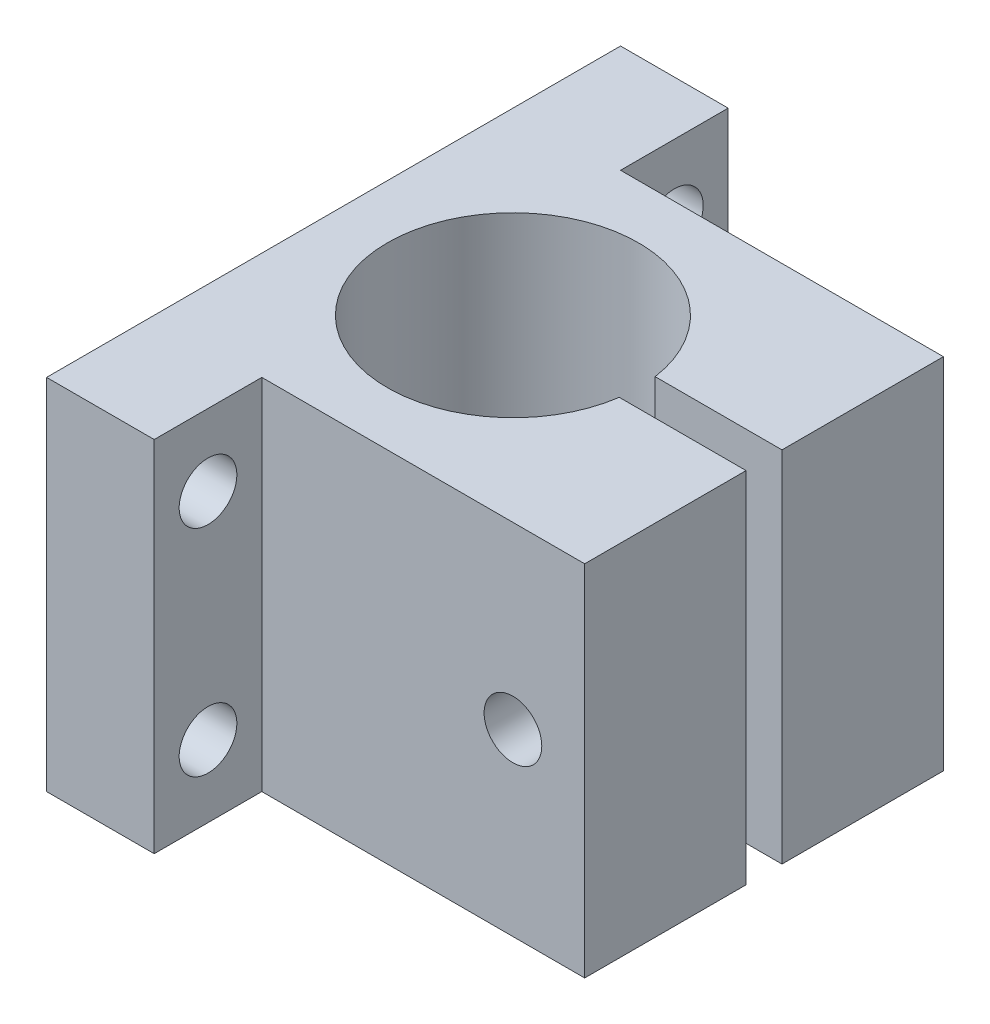
ISO-10303-21;
HEADER;
FILE_DESCRIPTION(('STEP AP214'),'2;1');
FILE_NAME('part.step','',(''),(''),'','','');
FILE_SCHEMA(('AUTOMOTIVE_DESIGN { 1 0 10303 214 1 1 1 1 }'));
ENDSEC;
DATA;
#1=APPLICATION_CONTEXT('core data for automotive mechanical design processes');
#2=APPLICATION_PROTOCOL_DEFINITION('international standard','automotive_design',2000,#1);
#3=PRODUCT_CONTEXT('',#1,'mechanical');
#4=PRODUCT('Part','Part','',(#3));
#5=PRODUCT_RELATED_PRODUCT_CATEGORY('part','',(#4));
#6=PRODUCT_DEFINITION_FORMATION('','',#4);
#7=PRODUCT_DEFINITION_CONTEXT('part definition',#1,'design');
#8=PRODUCT_DEFINITION('design','',#6,#7);
#9=PRODUCT_DEFINITION_SHAPE('','',#8);
#10=(LENGTH_UNIT() NAMED_UNIT(*) SI_UNIT(.MILLI.,.METRE.));
#11=(NAMED_UNIT(*) PLANE_ANGLE_UNIT() SI_UNIT($,.RADIAN.));
#12=(NAMED_UNIT(*) SI_UNIT($,.STERADIAN.) SOLID_ANGLE_UNIT());
#13=UNCERTAINTY_MEASURE_WITH_UNIT(LENGTH_MEASURE(1.E-05),#10,'distance_accuracy_value','');
#14=(GEOMETRIC_REPRESENTATION_CONTEXT(3) GLOBAL_UNCERTAINTY_ASSIGNED_CONTEXT((#13)) GLOBAL_UNIT_ASSIGNED_CONTEXT((#10,
#11,#12)) REPRESENTATION_CONTEXT('',''));
#15=CARTESIAN_POINT('',(0.,0.,0.));
#16=DIRECTION('',(0.,0.,1.));
#17=DIRECTION('',(1.,0.,0.));
#18=AXIS2_PLACEMENT_3D('',#15,#16,#17);
#19=CARTESIAN_POINT('',(19.05,31.75,-25.4));
#20=DIRECTION('',(-1.,0.,0.));
#21=DIRECTION('',(0.,0.,1.));
#22=AXIS2_PLACEMENT_3D('',#19,#20,#21);
#23=PLANE('',#22);
#24=DIRECTION('',(0.,0.,-1.));
#25=VECTOR('',#24,1.);
#26=CARTESIAN_POINT('',(19.05,0.,-25.4));
#27=LINE('',#26,#25);
#28=CARTESIAN_POINT('',(19.05,0.,15.875));
#29=VERTEX_POINT('',#28);
#30=CARTESIAN_POINT('',(19.05,0.,1.5875));
#31=VERTEX_POINT('',#30);
#32=EDGE_CURVE('E139',#29,#31,#27,.T.);
#33=ORIENTED_EDGE('',*,*,#32,.T.);
#34=DIRECTION('',(0.,-1.,0.));
#35=VECTOR('',#34,1.);
#36=CARTESIAN_POINT('',(19.05,0.,1.5875));
#37=LINE('',#36,#35);
#38=CARTESIAN_POINT('',(19.05,31.75,1.5875));
#39=VERTEX_POINT('',#38);
#40=EDGE_CURVE('E123',#39,#31,#37,.T.);
#41=ORIENTED_EDGE('',*,*,#40,.F.);
#42=DIRECTION('',(0.,0.,-1.));
#43=VECTOR('',#42,1.);
#44=CARTESIAN_POINT('',(19.05,31.75,-25.4));
#45=LINE('',#44,#43);
#46=CARTESIAN_POINT('',(19.05,31.75,15.875));
#47=VERTEX_POINT('',#46);
#48=EDGE_CURVE('E196',#47,#39,#45,.T.);
#49=ORIENTED_EDGE('',*,*,#48,.F.);
#50=DIRECTION('',(0.,1.,0.));
#51=VECTOR('',#50,1.);
#52=CARTESIAN_POINT('',(19.05,0.,15.875));
#53=LINE('',#52,#51);
#54=EDGE_CURVE('E146',#29,#47,#53,.T.);
#55=ORIENTED_EDGE('',*,*,#54,.F.);
#56=EDGE_LOOP('',(#33,#41,#49,#55));
#57=FACE_BOUND('',#56,.T.);
#58=ADVANCED_FACE('F36',(#57),#23,.F.);
#59=CARTESIAN_POINT('',(19.05,31.75,-1.5875));
#60=VERTEX_POINT('',#59);
#61=CARTESIAN_POINT('',(19.05,31.75,-15.875));
#62=VERTEX_POINT('',#61);
#63=EDGE_CURVE('E160',#60,#62,#45,.T.);
#64=ORIENTED_EDGE('',*,*,#63,.F.);
#65=DIRECTION('',(0.,1.,0.));
#66=VECTOR('',#65,1.);
#67=CARTESIAN_POINT('',(19.05,0.,-1.5875));
#68=LINE('',#67,#66);
#69=CARTESIAN_POINT('',(19.05,0.,-1.5875));
#70=VERTEX_POINT('',#69);
#71=EDGE_CURVE('E131',#70,#60,#68,.T.);
#72=ORIENTED_EDGE('',*,*,#71,.F.);
#73=CARTESIAN_POINT('',(19.05,0.,-15.875));
#74=VERTEX_POINT('',#73);
#75=EDGE_CURVE('E148',#70,#74,#27,.T.);
#76=ORIENTED_EDGE('',*,*,#75,.T.);
#77=DIRECTION('',(0.,1.,0.));
#78=VECTOR('',#77,1.);
#79=CARTESIAN_POINT('',(19.05,0.,-15.875));
#80=LINE('',#79,#78);
#81=EDGE_CURVE('E188',#74,#62,#80,.T.);
#82=ORIENTED_EDGE('',*,*,#81,.T.);
#83=EDGE_LOOP('',(#64,#72,#76,#82));
#84=FACE_BOUND('',#83,.T.);
#85=ADVANCED_FACE('F38',(#84),#23,.F.);
#86=CARTESIAN_POINT('',(-19.05,31.75,-25.4));
#87=DIRECTION('',(0.,0.,1.));
#88=DIRECTION('',(1.,0.,0.));
#89=AXIS2_PLACEMENT_3D('',#86,#87,#88);
#90=PLANE('',#89);
#91=DIRECTION('',(-1.,0.,0.));
#92=VECTOR('',#91,1.);
#93=CARTESIAN_POINT('',(-19.05,31.75,-25.4));
#94=LINE('',#93,#92);
#95=CARTESIAN_POINT('',(-9.52500000000001,31.75,-25.4));
#96=VERTEX_POINT('',#95);
#97=CARTESIAN_POINT('',(-19.05,31.75,-25.4));
#98=VERTEX_POINT('',#97);
#99=EDGE_CURVE('E198',#96,#98,#94,.T.);
#100=ORIENTED_EDGE('',*,*,#99,.F.);
#101=DIRECTION('',(0.,1.,0.));
#102=VECTOR('',#101,1.);
#103=CARTESIAN_POINT('',(-9.52500000000001,0.,-25.4));
#104=LINE('',#103,#102);
#105=CARTESIAN_POINT('',(-9.52500000000001,0.,-25.4));
#106=VERTEX_POINT('',#105);
#107=EDGE_CURVE('E229',#106,#96,#104,.T.);
#108=ORIENTED_EDGE('',*,*,#107,.F.);
#109=DIRECTION('',(-1.,0.,0.));
#110=VECTOR('',#109,1.);
#111=CARTESIAN_POINT('',(-19.05,0.,-25.4));
#112=LINE('',#111,#110);
#113=CARTESIAN_POINT('',(-19.05,0.,-25.4));
#114=VERTEX_POINT('',#113);
#115=EDGE_CURVE('E147',#106,#114,#112,.T.);
#116=ORIENTED_EDGE('',*,*,#115,.T.);
#117=DIRECTION('',(0.,-1.,0.));
#118=VECTOR('',#117,1.);
#119=CARTESIAN_POINT('',(-19.05,31.75,-25.4));
#120=LINE('',#119,#118);
#121=EDGE_CURVE('E164',#98,#114,#120,.T.);
#122=ORIENTED_EDGE('',*,*,#121,.F.);
#123=EDGE_LOOP('',(#100,#108,#116,#122));
#124=FACE_BOUND('',#123,.T.);
#125=ADVANCED_FACE('F245',(#124),#90,.F.);
#126=CARTESIAN_POINT('',(-19.05,31.75,-25.4));
#127=DIRECTION('',(1.,0.,0.));
#128=DIRECTION('',(0.,0.,-1.));
#129=AXIS2_PLACEMENT_3D('',#126,#127,#128);
#130=PLANE('',#129);
#131=CARTESIAN_POINT('',(-19.05,25.4,20.6375));
#132=DIRECTION('',(1.,0.,0.));
#133=DIRECTION('',(0.,0.,-1.));
#134=AXIS2_PLACEMENT_3D('',#131,#132,#133);
#135=CIRCLE('',#134,2.5527);
#136=CARTESIAN_POINT('',(-19.05,25.4,18.0848));
#137=VERTEX_POINT('',#136);
#138=EDGE_CURVE('E176',#137,#137,#135,.T.);
#139=ORIENTED_EDGE('',*,*,#138,.T.);
#140=EDGE_LOOP('',(#139));
#141=FACE_BOUND('',#140,.T.);
#142=CARTESIAN_POINT('',(-19.05,6.35,-20.6375));
#143=DIRECTION('',(1.,0.,0.));
#144=DIRECTION('',(0.,0.,-1.));
#145=AXIS2_PLACEMENT_3D('',#142,#143,#144);
#146=CIRCLE('',#145,2.5527);
#147=CARTESIAN_POINT('',(-19.05,6.35,-23.1902));
#148=VERTEX_POINT('',#147);
#149=EDGE_CURVE('E172',#148,#148,#146,.T.);
#150=ORIENTED_EDGE('',*,*,#149,.T.);
#151=EDGE_LOOP('',(#150));
#152=FACE_BOUND('',#151,.T.);
#153=CARTESIAN_POINT('',(-19.05,6.35,20.6375));
#154=DIRECTION('',(1.,0.,0.));
#155=DIRECTION('',(0.,0.,-1.));
#156=AXIS2_PLACEMENT_3D('',#153,#154,#155);
#157=CIRCLE('',#156,2.5527);
#158=CARTESIAN_POINT('',(-19.05,6.35,18.0848));
#159=VERTEX_POINT('',#158);
#160=EDGE_CURVE('E167',#159,#159,#157,.T.);
#161=ORIENTED_EDGE('',*,*,#160,.T.);
#162=EDGE_LOOP('',(#161));
#163=FACE_BOUND('',#162,.T.);
#164=CARTESIAN_POINT('',(-19.05,25.4,-20.6375));
#165=DIRECTION('',(1.,0.,0.));
#166=DIRECTION('',(0.,0.,-1.));
#167=AXIS2_PLACEMENT_3D('',#164,#165,#166);
#168=CIRCLE('',#167,2.5527);
#169=CARTESIAN_POINT('',(-19.05,25.4,-23.1902));
#170=VERTEX_POINT('',#169);
#171=EDGE_CURVE('E255',#170,#170,#168,.T.);
#172=ORIENTED_EDGE('',*,*,#171,.T.);
#173=EDGE_LOOP('',(#172));
#174=FACE_BOUND('',#173,.T.);
#175=DIRECTION('',(0.,0.,1.));
#176=VECTOR('',#175,1.);
#177=CARTESIAN_POINT('',(-19.05,0.,-25.4));
#178=LINE('',#177,#176);
#179=CARTESIAN_POINT('',(-19.05,0.,25.4));
#180=VERTEX_POINT('',#179);
#181=EDGE_CURVE('E150',#114,#180,#178,.T.);
#182=ORIENTED_EDGE('',*,*,#181,.T.);
#183=DIRECTION('',(0.,-1.,0.));
#184=VECTOR('',#183,1.);
#185=CARTESIAN_POINT('',(-19.05,31.75,25.4));
#186=LINE('',#185,#184);
#187=CARTESIAN_POINT('',(-19.05,31.75,25.4));
#188=VERTEX_POINT('',#187);
#189=EDGE_CURVE('E161',#188,#180,#186,.T.);
#190=ORIENTED_EDGE('',*,*,#189,.F.);
#191=DIRECTION('',(0.,0.,1.));
#192=VECTOR('',#191,1.);
#193=CARTESIAN_POINT('',(-19.05,31.75,-25.4));
#194=LINE('',#193,#192);
#195=EDGE_CURVE('E199',#98,#188,#194,.T.);
#196=ORIENTED_EDGE('',*,*,#195,.F.);
#197=ORIENTED_EDGE('',*,*,#121,.T.);
#198=EDGE_LOOP('',(#182,#190,#196,#197));
#199=FACE_BOUND('',#198,.T.);
#200=ADVANCED_FACE('F248',(#141,#152,#163,#174,#199),#130,.F.);
#201=CARTESIAN_POINT('',(-19.05,31.75,25.4));
#202=DIRECTION('',(0.,0.,-1.));
#203=DIRECTION('',(-1.,0.,0.));
#204=AXIS2_PLACEMENT_3D('',#201,#202,#203);
#205=PLANE('',#204);
#206=DIRECTION('',(1.,0.,0.));
#207=VECTOR('',#206,1.);
#208=CARTESIAN_POINT('',(-19.05,0.,25.4));
#209=LINE('',#208,#207);
#210=CARTESIAN_POINT('',(-9.525,0.,25.4));
#211=VERTEX_POINT('',#210);
#212=EDGE_CURVE('E157',#180,#211,#209,.T.);
#213=ORIENTED_EDGE('',*,*,#212,.T.);
#214=DIRECTION('',(0.,1.,0.));
#215=VECTOR('',#214,1.);
#216=CARTESIAN_POINT('',(-9.525,0.,25.4));
#217=LINE('',#216,#215);
#218=CARTESIAN_POINT('',(-9.525,31.75,25.4));
#219=VERTEX_POINT('',#218);
#220=EDGE_CURVE('E211',#211,#219,#217,.T.);
#221=ORIENTED_EDGE('',*,*,#220,.T.);
#222=DIRECTION('',(1.,0.,0.));
#223=VECTOR('',#222,1.);
#224=CARTESIAN_POINT('',(-19.05,31.75,25.4));
#225=LINE('',#224,#223);
#226=EDGE_CURVE('E153',#188,#219,#225,.T.);
#227=ORIENTED_EDGE('',*,*,#226,.F.);
#228=ORIENTED_EDGE('',*,*,#189,.T.);
#229=EDGE_LOOP('',(#213,#221,#227,#228));
#230=FACE_BOUND('',#229,.T.);
#231=ADVANCED_FACE('F209',(#230),#205,.F.);
#232=CARTESIAN_POINT('',(0.,31.75,0.));
#233=DIRECTION('',(0.,1.,0.));
#234=DIRECTION('',(0.,0.,1.));
#235=AXIS2_PLACEMENT_3D('',#232,#233,#234);
#236=PLANE('',#235);
#237=DIRECTION('',(1.,0.,0.));
#238=VECTOR('',#237,1.);
#239=CARTESIAN_POINT('',(-5.07999999999998,31.75,1.5875));
#240=LINE('',#239,#238);
#241=CARTESIAN_POINT('',(7.82352262806236,31.75,1.5875));
#242=VERTEX_POINT('',#241);
#243=EDGE_CURVE('E126',#242,#39,#240,.T.);
#244=ORIENTED_EDGE('',*,*,#243,.F.);
#245=CARTESIAN_POINT('',(-3.17500000000001,31.75,0.));
#246=DIRECTION('',(0.,1.,0.));
#247=DIRECTION('',(0.,0.,1.));
#248=AXIS2_PLACEMENT_3D('',#245,#246,#247);
#249=CIRCLE('',#248,11.1125);
#250=CARTESIAN_POINT('',(7.82352262806236,31.75,-1.5875));
#251=VERTEX_POINT('',#250);
#252=EDGE_CURVE('E184',#251,#242,#249,.T.);
#253=ORIENTED_EDGE('',*,*,#252,.F.);
#254=DIRECTION('',(1.,0.,0.));
#255=VECTOR('',#254,1.);
#256=CARTESIAN_POINT('',(-5.07999999999998,31.75,-1.5875));
#257=LINE('',#256,#255);
#258=EDGE_CURVE('E52',#251,#60,#257,.T.);
#259=ORIENTED_EDGE('',*,*,#258,.T.);
#260=ORIENTED_EDGE('',*,*,#63,.T.);
#261=DIRECTION('',(1.,0.,0.));
#262=VECTOR('',#261,1.);
#263=CARTESIAN_POINT('',(19.05,31.75,-15.875));
#264=LINE('',#263,#262);
#265=CARTESIAN_POINT('',(-9.52500000000001,31.75,-15.875));
#266=VERTEX_POINT('',#265);
#267=EDGE_CURVE('E226',#266,#62,#264,.T.);
#268=ORIENTED_EDGE('',*,*,#267,.F.);
#269=DIRECTION('',(0.,0.,1.));
#270=VECTOR('',#269,1.);
#271=CARTESIAN_POINT('',(-9.52500000000001,31.75,-25.4));
#272=LINE('',#271,#270);
#273=EDGE_CURVE('E230',#96,#266,#272,.T.);
#274=ORIENTED_EDGE('',*,*,#273,.F.);
#275=ORIENTED_EDGE('',*,*,#99,.T.);
#276=ORIENTED_EDGE('',*,*,#195,.T.);
#277=ORIENTED_EDGE('',*,*,#226,.T.);
#278=DIRECTION('',(0.,0.,1.));
#279=VECTOR('',#278,1.);
#280=CARTESIAN_POINT('',(-9.525,31.75,25.4));
#281=LINE('',#280,#279);
#282=CARTESIAN_POINT('',(-9.525,31.75,15.875));
#283=VERTEX_POINT('',#282);
#284=EDGE_CURVE('E206',#283,#219,#281,.T.);
#285=ORIENTED_EDGE('',*,*,#284,.F.);
#286=DIRECTION('',(-1.,0.,0.));
#287=VECTOR('',#286,1.);
#288=CARTESIAN_POINT('',(-9.525,31.75,15.875));
#289=LINE('',#288,#287);
#290=EDGE_CURVE('E250',#47,#283,#289,.T.);
#291=ORIENTED_EDGE('',*,*,#290,.F.);
#292=ORIENTED_EDGE('',*,*,#48,.T.);
#293=EDGE_LOOP('',(#244,#253,#259,#260,#268,#274,#275,#276,#277,#285,#291,#292));
#294=FACE_BOUND('',#293,.T.);
#295=ADVANCED_FACE('F186',(#294),#236,.T.);
#296=CARTESIAN_POINT('',(0.,0.,0.));
#297=DIRECTION('',(0.,1.,0.));
#298=DIRECTION('',(0.,0.,1.));
#299=AXIS2_PLACEMENT_3D('',#296,#297,#298);
#300=PLANE('',#299);
#301=CARTESIAN_POINT('',(-3.17500000000001,0.,0.));
#302=DIRECTION('',(0.,1.,0.));
#303=DIRECTION('',(0.,0.,1.));
#304=AXIS2_PLACEMENT_3D('',#301,#302,#303);
#305=CIRCLE('',#304,11.1125);
#306=CARTESIAN_POINT('',(7.82352262806236,0.,-1.5875));
#307=VERTEX_POINT('',#306);
#308=CARTESIAN_POINT('',(7.82352262806236,0.,1.5875));
#309=VERTEX_POINT('',#308);
#310=EDGE_CURVE('E142',#307,#309,#305,.T.);
#311=ORIENTED_EDGE('',*,*,#310,.T.);
#312=DIRECTION('',(1.,0.,0.));
#313=VECTOR('',#312,1.);
#314=CARTESIAN_POINT('',(-5.07999999999998,0.,1.5875));
#315=LINE('',#314,#313);
#316=EDGE_CURVE('E60',#309,#31,#315,.T.);
#317=ORIENTED_EDGE('',*,*,#316,.T.);
#318=ORIENTED_EDGE('',*,*,#32,.F.);
#319=DIRECTION('',(-1.,0.,0.));
#320=VECTOR('',#319,1.);
#321=CARTESIAN_POINT('',(-9.525,0.,15.875));
#322=LINE('',#321,#320);
#323=CARTESIAN_POINT('',(-9.525,0.,15.875));
#324=VERTEX_POINT('',#323);
#325=EDGE_CURVE('E214',#29,#324,#322,.T.);
#326=ORIENTED_EDGE('',*,*,#325,.T.);
#327=DIRECTION('',(0.,0.,1.));
#328=VECTOR('',#327,1.);
#329=CARTESIAN_POINT('',(-9.525,0.,25.4));
#330=LINE('',#329,#328);
#331=EDGE_CURVE('E218',#324,#211,#330,.T.);
#332=ORIENTED_EDGE('',*,*,#331,.T.);
#333=ORIENTED_EDGE('',*,*,#212,.F.);
#334=ORIENTED_EDGE('',*,*,#181,.F.);
#335=ORIENTED_EDGE('',*,*,#115,.F.);
#336=DIRECTION('',(0.,0.,1.));
#337=VECTOR('',#336,1.);
#338=CARTESIAN_POINT('',(-9.52500000000001,0.,-25.4));
#339=LINE('',#338,#337);
#340=CARTESIAN_POINT('',(-9.52500000000001,0.,-15.875));
#341=VERTEX_POINT('',#340);
#342=EDGE_CURVE('E222',#106,#341,#339,.T.);
#343=ORIENTED_EDGE('',*,*,#342,.T.);
#344=DIRECTION('',(1.,0.,0.));
#345=VECTOR('',#344,1.);
#346=CARTESIAN_POINT('',(19.05,0.,-15.875));
#347=LINE('',#346,#345);
#348=EDGE_CURVE('E225',#341,#74,#347,.T.);
#349=ORIENTED_EDGE('',*,*,#348,.T.);
#350=ORIENTED_EDGE('',*,*,#75,.F.);
#351=DIRECTION('',(1.,0.,0.));
#352=VECTOR('',#351,1.);
#353=CARTESIAN_POINT('',(-5.07999999999998,0.,-1.5875));
#354=LINE('',#353,#352);
#355=EDGE_CURVE('E143',#307,#70,#354,.T.);
#356=ORIENTED_EDGE('',*,*,#355,.F.);
#357=EDGE_LOOP('',(#311,#317,#318,#326,#332,#333,#334,#335,#343,#349,#350,#356));
#358=FACE_BOUND('',#357,.T.);
#359=ADVANCED_FACE('F137',(#358),#300,.F.);
#360=CARTESIAN_POINT('',(-3.17500000000001,0.,0.));
#361=DIRECTION('',(0.,1.,0.));
#362=DIRECTION('',(0.,0.,1.));
#363=AXIS2_PLACEMENT_3D('',#360,#361,#362);
#364=CYLINDRICAL_SURFACE('',#363,11.1125);
#365=ORIENTED_EDGE('',*,*,#252,.T.);
#366=DIRECTION('',(0.,1.,0.));
#367=VECTOR('',#366,1.);
#368=CARTESIAN_POINT('',(7.82352262806236,0.,1.5875));
#369=LINE('',#368,#367);
#370=EDGE_CURVE('E11',#242,#309,#369,.F.);
#371=ORIENTED_EDGE('',*,*,#370,.T.);
#372=ORIENTED_EDGE('',*,*,#310,.F.);
#373=DIRECTION('',(0.,1.,0.));
#374=VECTOR('',#373,1.);
#375=CARTESIAN_POINT('',(7.82352262806236,0.,-1.5875));
#376=LINE('',#375,#374);
#377=EDGE_CURVE('E45',#307,#251,#376,.T.);
#378=ORIENTED_EDGE('',*,*,#377,.T.);
#379=EDGE_LOOP('',(#365,#371,#372,#378));
#380=FACE_BOUND('',#379,.T.);
#381=ADVANCED_FACE('F183',(#380),#364,.F.);
#382=CARTESIAN_POINT('',(19.05,0.,-15.875));
#383=DIRECTION('',(0.,0.,1.));
#384=DIRECTION('',(1.,0.,0.));
#385=AXIS2_PLACEMENT_3D('',#382,#383,#384);
#386=PLANE('',#385);
#387=CARTESIAN_POINT('',(12.7,15.875,-15.875));
#388=DIRECTION('',(0.,0.,1.));
#389=DIRECTION('',(1.,0.,0.));
#390=AXIS2_PLACEMENT_3D('',#387,#388,#389);
#391=CIRCLE('',#390,2.55269999999999);
#392=CARTESIAN_POINT('',(15.2527,15.875,-15.875));
#393=VERTEX_POINT('',#392);
#394=EDGE_CURVE('E40',#393,#393,#391,.T.);
#395=ORIENTED_EDGE('',*,*,#394,.T.);
#396=EDGE_LOOP('',(#395));
#397=FACE_BOUND('',#396,.T.);
#398=ORIENTED_EDGE('',*,*,#267,.T.);
#399=ORIENTED_EDGE('',*,*,#81,.F.);
#400=ORIENTED_EDGE('',*,*,#348,.F.);
#401=DIRECTION('',(0.,1.,0.));
#402=VECTOR('',#401,1.);
#403=CARTESIAN_POINT('',(-9.52500000000001,0.,-15.875));
#404=LINE('',#403,#402);
#405=EDGE_CURVE('E192',#341,#266,#404,.T.);
#406=ORIENTED_EDGE('',*,*,#405,.T.);
#407=EDGE_LOOP('',(#398,#399,#400,#406));
#408=FACE_BOUND('',#407,.T.);
#409=ADVANCED_FACE('F287',(#397,#408),#386,.F.);
#410=CARTESIAN_POINT('',(-9.52500000000001,0.,-25.4));
#411=DIRECTION('',(-1.,0.,0.));
#412=DIRECTION('',(0.,0.,1.));
#413=AXIS2_PLACEMENT_3D('',#410,#411,#412);
#414=PLANE('',#413);
#415=CARTESIAN_POINT('',(-9.525,6.35,-20.6375));
#416=DIRECTION('',(1.,0.,0.));
#417=DIRECTION('',(0.,0.,-1.));
#418=AXIS2_PLACEMENT_3D('',#415,#416,#417);
#419=CIRCLE('',#418,2.5527);
#420=CARTESIAN_POINT('',(-9.525,6.35,-23.1902));
#421=VERTEX_POINT('',#420);
#422=EDGE_CURVE('E175',#421,#421,#419,.T.);
#423=ORIENTED_EDGE('',*,*,#422,.F.);
#424=EDGE_LOOP('',(#423));
#425=FACE_BOUND('',#424,.T.);
#426=CARTESIAN_POINT('',(-9.525,25.4,-20.6375));
#427=DIRECTION('',(1.,0.,0.));
#428=DIRECTION('',(0.,0.,-1.));
#429=AXIS2_PLACEMENT_3D('',#426,#427,#428);
#430=CIRCLE('',#429,2.5527);
#431=CARTESIAN_POINT('',(-9.525,25.4,-23.1902));
#432=VERTEX_POINT('',#431);
#433=EDGE_CURVE('E170',#432,#432,#430,.T.);
#434=ORIENTED_EDGE('',*,*,#433,.F.);
#435=EDGE_LOOP('',(#434));
#436=FACE_BOUND('',#435,.T.);
#437=ORIENTED_EDGE('',*,*,#273,.T.);
#438=ORIENTED_EDGE('',*,*,#405,.F.);
#439=ORIENTED_EDGE('',*,*,#342,.F.);
#440=ORIENTED_EDGE('',*,*,#107,.T.);
#441=EDGE_LOOP('',(#437,#438,#439,#440));
#442=FACE_BOUND('',#441,.T.);
#443=ADVANCED_FACE('F238',(#425,#436,#442),#414,.F.);
#444=CARTESIAN_POINT('',(-9.525,0.,25.4));
#445=DIRECTION('',(-1.,0.,0.));
#446=DIRECTION('',(0.,0.,1.));
#447=AXIS2_PLACEMENT_3D('',#444,#445,#446);
#448=PLANE('',#447);
#449=CARTESIAN_POINT('',(-9.525,25.4,20.6375));
#450=DIRECTION('',(1.,0.,0.));
#451=DIRECTION('',(0.,0.,-1.));
#452=AXIS2_PLACEMENT_3D('',#449,#450,#451);
#453=CIRCLE('',#452,2.5527);
#454=CARTESIAN_POINT('',(-9.525,25.4,18.0848));
#455=VERTEX_POINT('',#454);
#456=EDGE_CURVE('E179',#455,#455,#453,.T.);
#457=ORIENTED_EDGE('',*,*,#456,.F.);
#458=EDGE_LOOP('',(#457));
#459=FACE_BOUND('',#458,.T.);
#460=CARTESIAN_POINT('',(-9.525,6.35,20.6375));
#461=DIRECTION('',(1.,0.,0.));
#462=DIRECTION('',(0.,0.,-1.));
#463=AXIS2_PLACEMENT_3D('',#460,#461,#462);
#464=CIRCLE('',#463,2.5527);
#465=CARTESIAN_POINT('',(-9.525,6.35,18.0848));
#466=VERTEX_POINT('',#465);
#467=EDGE_CURVE('E171',#466,#466,#464,.T.);
#468=ORIENTED_EDGE('',*,*,#467,.F.);
#469=EDGE_LOOP('',(#468));
#470=FACE_BOUND('',#469,.T.);
#471=ORIENTED_EDGE('',*,*,#284,.T.);
#472=ORIENTED_EDGE('',*,*,#220,.F.);
#473=ORIENTED_EDGE('',*,*,#331,.F.);
#474=DIRECTION('',(0.,1.,0.));
#475=VECTOR('',#474,1.);
#476=CARTESIAN_POINT('',(-9.525,0.,15.875));
#477=LINE('',#476,#475);
#478=EDGE_CURVE('E216',#324,#283,#477,.T.);
#479=ORIENTED_EDGE('',*,*,#478,.T.);
#480=EDGE_LOOP('',(#471,#472,#473,#479));
#481=FACE_BOUND('',#480,.T.);
#482=ADVANCED_FACE('F258',(#459,#470,#481),#448,.F.);
#483=CARTESIAN_POINT('',(-9.525,0.,15.875));
#484=DIRECTION('',(0.,0.,-1.));
#485=DIRECTION('',(-1.,0.,0.));
#486=AXIS2_PLACEMENT_3D('',#483,#484,#485);
#487=PLANE('',#486);
#488=CARTESIAN_POINT('',(12.7,15.875,15.875));
#489=DIRECTION('',(0.,0.,1.));
#490=DIRECTION('',(1.,0.,0.));
#491=AXIS2_PLACEMENT_3D('',#488,#489,#490);
#492=CIRCLE('',#491,2.55269999999999);
#493=CARTESIAN_POINT('',(15.2527,15.875,15.875));
#494=VERTEX_POINT('',#493);
#495=EDGE_CURVE('E329',#494,#494,#492,.T.);
#496=ORIENTED_EDGE('',*,*,#495,.F.);
#497=EDGE_LOOP('',(#496));
#498=FACE_BOUND('',#497,.T.);
#499=ORIENTED_EDGE('',*,*,#290,.T.);
#500=ORIENTED_EDGE('',*,*,#478,.F.);
#501=ORIENTED_EDGE('',*,*,#325,.F.);
#502=ORIENTED_EDGE('',*,*,#54,.T.);
#503=EDGE_LOOP('',(#499,#500,#501,#502));
#504=FACE_BOUND('',#503,.T.);
#505=ADVANCED_FACE('F260',(#498,#504),#487,.F.);
#506=CARTESIAN_POINT('',(-9.525,25.4,-20.6375));
#507=DIRECTION('',(1.,0.,0.));
#508=DIRECTION('',(0.,0.,-1.));
#509=AXIS2_PLACEMENT_3D('',#506,#507,#508);
#510=CYLINDRICAL_SURFACE('',#509,2.5527);
#511=ORIENTED_EDGE('',*,*,#433,.T.);
#512=EDGE_LOOP('',(#511));
#513=FACE_BOUND('',#512,.T.);
#514=ORIENTED_EDGE('',*,*,#171,.F.);
#515=EDGE_LOOP('',(#514));
#516=FACE_BOUND('',#515,.T.);
#517=ADVANCED_FACE('F262',(#513,#516),#510,.F.);
#518=CARTESIAN_POINT('',(-9.525,6.35,20.6375));
#519=DIRECTION('',(1.,0.,0.));
#520=DIRECTION('',(0.,0.,-1.));
#521=AXIS2_PLACEMENT_3D('',#518,#519,#520);
#522=CYLINDRICAL_SURFACE('',#521,2.5527);
#523=ORIENTED_EDGE('',*,*,#467,.T.);
#524=EDGE_LOOP('',(#523));
#525=FACE_BOUND('',#524,.T.);
#526=ORIENTED_EDGE('',*,*,#160,.F.);
#527=EDGE_LOOP('',(#526));
#528=FACE_BOUND('',#527,.T.);
#529=ADVANCED_FACE('F269',(#525,#528),#522,.F.);
#530=CARTESIAN_POINT('',(-9.525,6.35,-20.6375));
#531=DIRECTION('',(1.,0.,0.));
#532=DIRECTION('',(0.,0.,-1.));
#533=AXIS2_PLACEMENT_3D('',#530,#531,#532);
#534=CYLINDRICAL_SURFACE('',#533,2.5527);
#535=ORIENTED_EDGE('',*,*,#422,.T.);
#536=EDGE_LOOP('',(#535));
#537=FACE_BOUND('',#536,.T.);
#538=ORIENTED_EDGE('',*,*,#149,.F.);
#539=EDGE_LOOP('',(#538));
#540=FACE_BOUND('',#539,.T.);
#541=ADVANCED_FACE('F350',(#537,#540),#534,.F.);
#542=CARTESIAN_POINT('',(-9.525,25.4,20.6375));
#543=DIRECTION('',(1.,0.,0.));
#544=DIRECTION('',(0.,0.,-1.));
#545=AXIS2_PLACEMENT_3D('',#542,#543,#544);
#546=CYLINDRICAL_SURFACE('',#545,2.5527);
#547=ORIENTED_EDGE('',*,*,#456,.T.);
#548=EDGE_LOOP('',(#547));
#549=FACE_BOUND('',#548,.T.);
#550=ORIENTED_EDGE('',*,*,#138,.F.);
#551=EDGE_LOOP('',(#550));
#552=FACE_BOUND('',#551,.T.);
#553=ADVANCED_FACE('F340',(#549,#552),#546,.F.);
#554=CARTESIAN_POINT('',(-5.07999999999998,0.,-1.5875));
#555=DIRECTION('',(0.,0.,-1.));
#556=DIRECTION('',(-1.,0.,0.));
#557=AXIS2_PLACEMENT_3D('',#554,#555,#556);
#558=PLANE('',#557);
#559=CARTESIAN_POINT('',(12.7,15.875,-1.5875));
#560=DIRECTION('',(0.,0.,-1.));
#561=DIRECTION('',(-1.,0.,0.));
#562=AXIS2_PLACEMENT_3D('',#559,#560,#561);
#563=CIRCLE('',#562,2.55269999999999);
#564=CARTESIAN_POINT('',(10.1473,15.875,-1.5875));
#565=VERTEX_POINT('',#564);
#566=EDGE_CURVE('E132',#565,#565,#563,.T.);
#567=ORIENTED_EDGE('',*,*,#566,.T.);
#568=EDGE_LOOP('',(#567));
#569=FACE_BOUND('',#568,.T.);
#570=ORIENTED_EDGE('',*,*,#355,.T.);
#571=ORIENTED_EDGE('',*,*,#71,.T.);
#572=ORIENTED_EDGE('',*,*,#258,.F.);
#573=ORIENTED_EDGE('',*,*,#377,.F.);
#574=EDGE_LOOP('',(#570,#571,#572,#573));
#575=FACE_BOUND('',#574,.T.);
#576=ADVANCED_FACE('F338',(#569,#575),#558,.F.);
#577=CARTESIAN_POINT('',(-5.07999999999998,0.,1.5875));
#578=DIRECTION('',(0.,0.,1.));
#579=DIRECTION('',(1.,0.,0.));
#580=AXIS2_PLACEMENT_3D('',#577,#578,#579);
#581=PLANE('',#580);
#582=CARTESIAN_POINT('',(12.7,15.875,1.5875));
#583=DIRECTION('',(0.,0.,1.));
#584=DIRECTION('',(1.,0.,0.));
#585=AXIS2_PLACEMENT_3D('',#582,#583,#584);
#586=CIRCLE('',#585,2.55269999999999);
#587=CARTESIAN_POINT('',(15.2527,15.875,1.5875));
#588=VERTEX_POINT('',#587);
#589=EDGE_CURVE('E328',#588,#588,#586,.T.);
#590=ORIENTED_EDGE('',*,*,#589,.T.);
#591=EDGE_LOOP('',(#590));
#592=FACE_BOUND('',#591,.T.);
#593=ORIENTED_EDGE('',*,*,#243,.T.);
#594=ORIENTED_EDGE('',*,*,#40,.T.);
#595=ORIENTED_EDGE('',*,*,#316,.F.);
#596=ORIENTED_EDGE('',*,*,#370,.F.);
#597=EDGE_LOOP('',(#593,#594,#595,#596));
#598=FACE_BOUND('',#597,.T.);
#599=ADVANCED_FACE('F124',(#592,#598),#581,.F.);
#600=CARTESIAN_POINT('',(12.7,15.875,15.875));
#601=DIRECTION('',(0.,0.,1.));
#602=DIRECTION('',(1.,0.,0.));
#603=AXIS2_PLACEMENT_3D('',#600,#601,#602);
#604=CYLINDRICAL_SURFACE('',#603,2.55269999999999);
#605=ORIENTED_EDGE('',*,*,#394,.F.);
#606=EDGE_LOOP('',(#605));
#607=FACE_BOUND('',#606,.T.);
#608=ORIENTED_EDGE('',*,*,#566,.F.);
#609=EDGE_LOOP('',(#608));
#610=FACE_BOUND('',#609,.T.);
#611=ADVANCED_FACE('F347',(#607,#610),#604,.F.);
#612=ORIENTED_EDGE('',*,*,#495,.T.);
#613=EDGE_LOOP('',(#612));
#614=FACE_BOUND('',#613,.T.);
#615=ORIENTED_EDGE('',*,*,#589,.F.);
#616=EDGE_LOOP('',(#615));
#617=FACE_BOUND('',#616,.T.);
#618=ADVANCED_FACE('F435',(#614,#617),#604,.F.);
#619=CLOSED_SHELL('',(#58,#85,#125,#200,#231,#295,#359,#381,#409,#443,#482,#505,#517,#529,#541,
#553,#576,#599,#611,#618));
#620=MANIFOLD_SOLID_BREP('B2',#619);
#621=ADVANCED_BREP_SHAPE_REPRESENTATION('',(#18,#620),#14);
#622=SHAPE_DEFINITION_REPRESENTATION(#9,#621);
ENDSEC;
END-ISO-10303-21;
